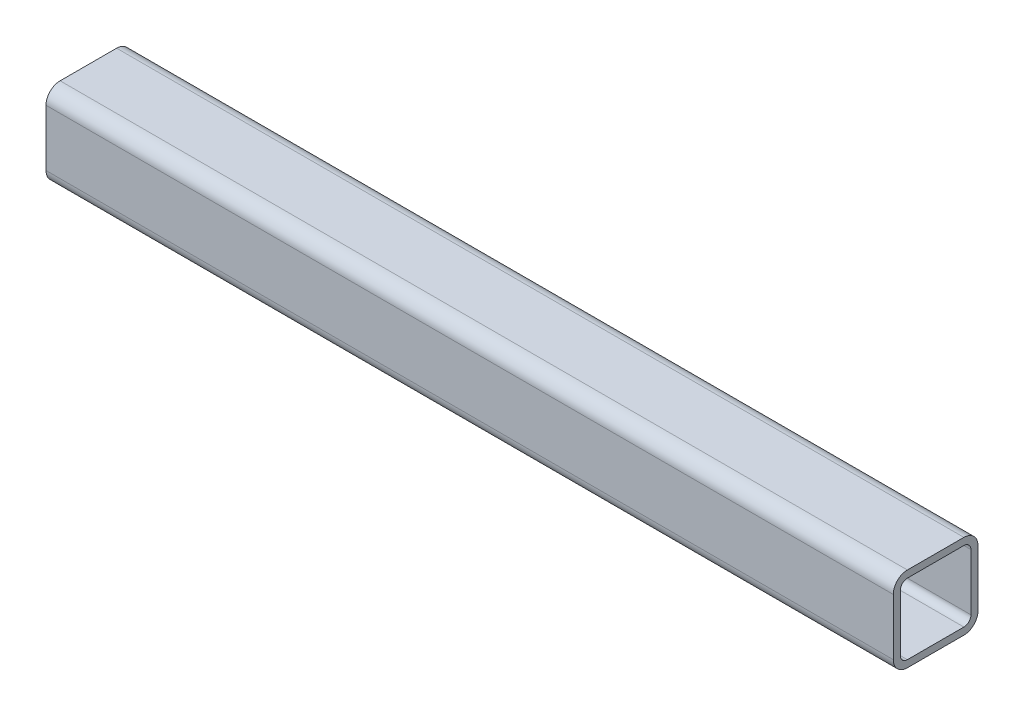
ISO-10303-21;
HEADER;
FILE_DESCRIPTION(('STEP AP214'),'2;1');
FILE_NAME('part.step','',(''),(''),'','','');
FILE_SCHEMA(('AUTOMOTIVE_DESIGN { 1 0 10303 214 1 1 1 1 }'));
ENDSEC;
DATA;
#1=APPLICATION_CONTEXT('core data for automotive mechanical design processes');
#2=APPLICATION_PROTOCOL_DEFINITION('international standard','automotive_design',2000,#1);
#3=PRODUCT_CONTEXT('',#1,'mechanical');
#4=PRODUCT('Part','Part','',(#3));
#5=PRODUCT_RELATED_PRODUCT_CATEGORY('part','',(#4));
#6=PRODUCT_DEFINITION_FORMATION('','',#4);
#7=PRODUCT_DEFINITION_CONTEXT('part definition',#1,'design');
#8=PRODUCT_DEFINITION('design','',#6,#7);
#9=PRODUCT_DEFINITION_SHAPE('','',#8);
#10=(LENGTH_UNIT() NAMED_UNIT(*) SI_UNIT(.MILLI.,.METRE.));
#11=(NAMED_UNIT(*) PLANE_ANGLE_UNIT() SI_UNIT($,.RADIAN.));
#12=(NAMED_UNIT(*) SI_UNIT($,.STERADIAN.) SOLID_ANGLE_UNIT());
#13=UNCERTAINTY_MEASURE_WITH_UNIT(LENGTH_MEASURE(1.E-05),#10,'distance_accuracy_value','');
#14=(GEOMETRIC_REPRESENTATION_CONTEXT(3) GLOBAL_UNCERTAINTY_ASSIGNED_CONTEXT((#13)) GLOBAL_UNIT_ASSIGNED_CONTEXT((#10,
#11,#12)) REPRESENTATION_CONTEXT('',''));
#15=CARTESIAN_POINT('',(0.,0.,0.));
#16=DIRECTION('',(0.,0.,1.));
#17=DIRECTION('',(1.,0.,0.));
#18=AXIS2_PLACEMENT_3D('',#15,#16,#17);
#19=CARTESIAN_POINT('',(-762.,25.4,25.4));
#20=DIRECTION('',(1.,0.,0.));
#21=DIRECTION('',(0.,0.,-1.));
#22=AXIS2_PLACEMENT_3D('',#19,#20,#21);
#23=CYLINDRICAL_SURFACE('',#22,12.7);
#24=CARTESIAN_POINT('',(0.,25.4,25.4));
#25=DIRECTION('',(-1.,0.,0.));
#26=DIRECTION('',(0.,0.,1.));
#27=AXIS2_PLACEMENT_3D('',#24,#25,#26);
#28=CIRCLE('',#27,12.7);
#29=CARTESIAN_POINT('',(0.,25.4,38.1));
#30=VERTEX_POINT('',#29);
#31=CARTESIAN_POINT('',(0.,38.1,25.4));
#32=VERTEX_POINT('',#31);
#33=EDGE_CURVE('E233',#30,#32,#28,.T.);
#34=ORIENTED_EDGE('',*,*,#33,.T.);
#35=DIRECTION('',(1.,0.,0.));
#36=VECTOR('',#35,1.);
#37=CARTESIAN_POINT('',(-762.,38.1,25.4));
#38=LINE('',#37,#36);
#39=CARTESIAN_POINT('',(-762.,38.1,25.4));
#40=VERTEX_POINT('',#39);
#41=EDGE_CURVE('E12',#40,#32,#38,.T.);
#42=ORIENTED_EDGE('',*,*,#41,.F.);
#43=CARTESIAN_POINT('',(-762.,25.4,25.4));
#44=DIRECTION('',(-1.,0.,0.));
#45=DIRECTION('',(0.,0.,1.));
#46=AXIS2_PLACEMENT_3D('',#43,#44,#45);
#47=CIRCLE('',#46,12.7);
#48=CARTESIAN_POINT('',(-762.,25.4,38.1));
#49=VERTEX_POINT('',#48);
#50=EDGE_CURVE('E311',#49,#40,#47,.T.);
#51=ORIENTED_EDGE('',*,*,#50,.F.);
#52=DIRECTION('',(1.,0.,0.));
#53=VECTOR('',#52,1.);
#54=CARTESIAN_POINT('',(-762.,25.4,38.1));
#55=LINE('',#54,#53);
#56=EDGE_CURVE('E248',#49,#30,#55,.T.);
#57=ORIENTED_EDGE('',*,*,#56,.T.);
#58=EDGE_LOOP('',(#34,#42,#51,#57));
#59=FACE_BOUND('',#58,.T.);
#60=ADVANCED_FACE('F61',(#59),#23,.T.);
#61=CARTESIAN_POINT('',(-762.,38.1,25.4));
#62=DIRECTION('',(0.,-1.,0.));
#63=DIRECTION('',(0.,0.,-1.));
#64=AXIS2_PLACEMENT_3D('',#61,#62,#63);
#65=PLANE('',#64);
#66=DIRECTION('',(0.,0.,-1.));
#67=VECTOR('',#66,1.);
#68=CARTESIAN_POINT('',(0.,38.1,25.4));
#69=LINE('',#68,#67);
#70=CARTESIAN_POINT('',(0.,38.1,-25.4));
#71=VERTEX_POINT('',#70);
#72=EDGE_CURVE('E236',#32,#71,#69,.T.);
#73=ORIENTED_EDGE('',*,*,#72,.T.);
#74=DIRECTION('',(1.,0.,0.));
#75=VECTOR('',#74,1.);
#76=CARTESIAN_POINT('',(-762.,38.1,-25.4));
#77=LINE('',#76,#75);
#78=CARTESIAN_POINT('',(-762.,38.1,-25.4));
#79=VERTEX_POINT('',#78);
#80=EDGE_CURVE('E71',#79,#71,#77,.T.);
#81=ORIENTED_EDGE('',*,*,#80,.F.);
#82=DIRECTION('',(0.,0.,-1.));
#83=VECTOR('',#82,1.);
#84=CARTESIAN_POINT('',(-762.,38.1,25.4));
#85=LINE('',#84,#83);
#86=EDGE_CURVE('E313',#40,#79,#85,.T.);
#87=ORIENTED_EDGE('',*,*,#86,.F.);
#88=ORIENTED_EDGE('',*,*,#41,.T.);
#89=EDGE_LOOP('',(#73,#81,#87,#88));
#90=FACE_BOUND('',#89,.T.);
#91=ADVANCED_FACE('F348',(#90),#65,.F.);
#92=CARTESIAN_POINT('',(-762.,25.4,-25.4));
#93=DIRECTION('',(1.,0.,0.));
#94=DIRECTION('',(0.,0.,-1.));
#95=AXIS2_PLACEMENT_3D('',#92,#93,#94);
#96=CYLINDRICAL_SURFACE('',#95,12.7);
#97=CARTESIAN_POINT('',(0.,25.4,-25.4));
#98=DIRECTION('',(-1.,0.,0.));
#99=DIRECTION('',(0.,0.,1.));
#100=AXIS2_PLACEMENT_3D('',#97,#98,#99);
#101=CIRCLE('',#100,12.7);
#102=CARTESIAN_POINT('',(0.,25.4,-38.1));
#103=VERTEX_POINT('',#102);
#104=EDGE_CURVE('E238',#71,#103,#101,.T.);
#105=ORIENTED_EDGE('',*,*,#104,.T.);
#106=DIRECTION('',(1.,0.,0.));
#107=VECTOR('',#106,1.);
#108=CARTESIAN_POINT('',(-762.,25.4,-38.1));
#109=LINE('',#108,#107);
#110=CARTESIAN_POINT('',(-762.,25.4,-38.1));
#111=VERTEX_POINT('',#110);
#112=EDGE_CURVE('E255',#111,#103,#109,.T.);
#113=ORIENTED_EDGE('',*,*,#112,.F.);
#114=CARTESIAN_POINT('',(-762.,25.4,-25.4));
#115=DIRECTION('',(-1.,0.,0.));
#116=DIRECTION('',(0.,0.,1.));
#117=AXIS2_PLACEMENT_3D('',#114,#115,#116);
#118=CIRCLE('',#117,12.7);
#119=EDGE_CURVE('E315',#79,#111,#118,.T.);
#120=ORIENTED_EDGE('',*,*,#119,.F.);
#121=ORIENTED_EDGE('',*,*,#80,.T.);
#122=EDGE_LOOP('',(#105,#113,#120,#121));
#123=FACE_BOUND('',#122,.T.);
#124=ADVANCED_FACE('F353',(#123),#96,.T.);
#125=CARTESIAN_POINT('',(-762.,-25.4,-38.1));
#126=DIRECTION('',(0.,0.,1.));
#127=DIRECTION('',(1.,0.,0.));
#128=AXIS2_PLACEMENT_3D('',#125,#126,#127);
#129=PLANE('',#128);
#130=DIRECTION('',(0.,-1.,0.));
#131=VECTOR('',#130,1.);
#132=CARTESIAN_POINT('',(0.,-25.4,-38.1));
#133=LINE('',#132,#131);
#134=CARTESIAN_POINT('',(0.,-25.4,-38.1));
#135=VERTEX_POINT('',#134);
#136=EDGE_CURVE('E240',#103,#135,#133,.T.);
#137=ORIENTED_EDGE('',*,*,#136,.T.);
#138=DIRECTION('',(1.,0.,0.));
#139=VECTOR('',#138,1.);
#140=CARTESIAN_POINT('',(-762.,-25.4,-38.1));
#141=LINE('',#140,#139);
#142=CARTESIAN_POINT('',(-762.,-25.4,-38.1));
#143=VERTEX_POINT('',#142);
#144=EDGE_CURVE('E252',#143,#135,#141,.T.);
#145=ORIENTED_EDGE('',*,*,#144,.F.);
#146=DIRECTION('',(0.,-1.,0.));
#147=VECTOR('',#146,1.);
#148=CARTESIAN_POINT('',(-762.,-25.4,-38.1));
#149=LINE('',#148,#147);
#150=EDGE_CURVE('E317',#111,#143,#149,.T.);
#151=ORIENTED_EDGE('',*,*,#150,.F.);
#152=ORIENTED_EDGE('',*,*,#112,.T.);
#153=EDGE_LOOP('',(#137,#145,#151,#152));
#154=FACE_BOUND('',#153,.T.);
#155=ADVANCED_FACE('F323',(#154),#129,.F.);
#156=CARTESIAN_POINT('',(-762.,-25.4,-25.4));
#157=DIRECTION('',(1.,0.,0.));
#158=DIRECTION('',(0.,0.,-1.));
#159=AXIS2_PLACEMENT_3D('',#156,#157,#158);
#160=CYLINDRICAL_SURFACE('',#159,12.7);
#161=CARTESIAN_POINT('',(0.,-25.4,-25.4));
#162=DIRECTION('',(-1.,0.,0.));
#163=DIRECTION('',(0.,0.,1.));
#164=AXIS2_PLACEMENT_3D('',#161,#162,#163);
#165=CIRCLE('',#164,12.7);
#166=CARTESIAN_POINT('',(0.,-38.1,-25.4));
#167=VERTEX_POINT('',#166);
#168=EDGE_CURVE('E242',#135,#167,#165,.T.);
#169=ORIENTED_EDGE('',*,*,#168,.T.);
#170=DIRECTION('',(1.,0.,0.));
#171=VECTOR('',#170,1.);
#172=CARTESIAN_POINT('',(-762.,-38.1,-25.4));
#173=LINE('',#172,#171);
#174=CARTESIAN_POINT('',(-762.,-38.1,-25.4));
#175=VERTEX_POINT('',#174);
#176=EDGE_CURVE('E200',#175,#167,#173,.T.);
#177=ORIENTED_EDGE('',*,*,#176,.F.);
#178=CARTESIAN_POINT('',(-762.,-25.4,-25.4));
#179=DIRECTION('',(-1.,0.,0.));
#180=DIRECTION('',(0.,0.,1.));
#181=AXIS2_PLACEMENT_3D('',#178,#179,#180);
#182=CIRCLE('',#181,12.7);
#183=EDGE_CURVE('E191',#143,#175,#182,.T.);
#184=ORIENTED_EDGE('',*,*,#183,.F.);
#185=ORIENTED_EDGE('',*,*,#144,.T.);
#186=EDGE_LOOP('',(#169,#177,#184,#185));
#187=FACE_BOUND('',#186,.T.);
#188=ADVANCED_FACE('F327',(#187),#160,.T.);
#189=CARTESIAN_POINT('',(-762.,-38.1,-25.4));
#190=DIRECTION('',(0.,1.,0.));
#191=DIRECTION('',(0.,0.,1.));
#192=AXIS2_PLACEMENT_3D('',#189,#190,#191);
#193=PLANE('',#192);
#194=DIRECTION('',(0.,0.,1.));
#195=VECTOR('',#194,1.);
#196=CARTESIAN_POINT('',(0.,-38.1,-25.4));
#197=LINE('',#196,#195);
#198=CARTESIAN_POINT('',(0.,-38.1,25.4));
#199=VERTEX_POINT('',#198);
#200=EDGE_CURVE('E199',#167,#199,#197,.T.);
#201=ORIENTED_EDGE('',*,*,#200,.T.);
#202=DIRECTION('',(1.,0.,0.));
#203=VECTOR('',#202,1.);
#204=CARTESIAN_POINT('',(-762.,-38.1,25.4));
#205=LINE('',#204,#203);
#206=CARTESIAN_POINT('',(-762.,-38.1,25.4));
#207=VERTEX_POINT('',#206);
#208=EDGE_CURVE('E196',#207,#199,#205,.T.);
#209=ORIENTED_EDGE('',*,*,#208,.F.);
#210=DIRECTION('',(0.,0.,1.));
#211=VECTOR('',#210,1.);
#212=CARTESIAN_POINT('',(-762.,-38.1,-25.4));
#213=LINE('',#212,#211);
#214=EDGE_CURVE('E185',#175,#207,#213,.T.);
#215=ORIENTED_EDGE('',*,*,#214,.F.);
#216=ORIENTED_EDGE('',*,*,#176,.T.);
#217=EDGE_LOOP('',(#201,#209,#215,#216));
#218=FACE_BOUND('',#217,.T.);
#219=ADVANCED_FACE('F197',(#218),#193,.F.);
#220=CARTESIAN_POINT('',(-762.,-25.4,25.4));
#221=DIRECTION('',(1.,0.,0.));
#222=DIRECTION('',(0.,0.,-1.));
#223=AXIS2_PLACEMENT_3D('',#220,#221,#222);
#224=CYLINDRICAL_SURFACE('',#223,12.7);
#225=CARTESIAN_POINT('',(0.,-25.4,25.4));
#226=DIRECTION('',(-1.,0.,0.));
#227=DIRECTION('',(0.,0.,1.));
#228=AXIS2_PLACEMENT_3D('',#225,#226,#227);
#229=CIRCLE('',#228,12.7);
#230=CARTESIAN_POINT('',(0.,-25.4,38.1));
#231=VERTEX_POINT('',#230);
#232=EDGE_CURVE('E133',#199,#231,#229,.T.);
#233=ORIENTED_EDGE('',*,*,#232,.T.);
#234=DIRECTION('',(1.,0.,0.));
#235=VECTOR('',#234,1.);
#236=CARTESIAN_POINT('',(-762.,-25.4,38.1));
#237=LINE('',#236,#235);
#238=CARTESIAN_POINT('',(-762.,-25.4,38.1));
#239=VERTEX_POINT('',#238);
#240=EDGE_CURVE('E201',#239,#231,#237,.T.);
#241=ORIENTED_EDGE('',*,*,#240,.F.);
#242=CARTESIAN_POINT('',(-762.,-25.4,25.4));
#243=DIRECTION('',(-1.,0.,0.));
#244=DIRECTION('',(0.,0.,1.));
#245=AXIS2_PLACEMENT_3D('',#242,#243,#244);
#246=CIRCLE('',#245,12.7);
#247=EDGE_CURVE('E189',#207,#239,#246,.T.);
#248=ORIENTED_EDGE('',*,*,#247,.F.);
#249=ORIENTED_EDGE('',*,*,#208,.T.);
#250=EDGE_LOOP('',(#233,#241,#248,#249));
#251=FACE_BOUND('',#250,.T.);
#252=ADVANCED_FACE('F203',(#251),#224,.T.);
#253=CARTESIAN_POINT('',(-762.,25.4,-25.4));
#254=DIRECTION('',(1.,0.,0.));
#255=DIRECTION('',(0.,0.,-1.));
#256=AXIS2_PLACEMENT_3D('',#253,#254,#255);
#257=CYLINDRICAL_SURFACE('',#256,6.34999999999999);
#258=CARTESIAN_POINT('',(0.,25.4,-25.4));
#259=DIRECTION('',(-1.,0.,0.));
#260=DIRECTION('',(0.,0.,1.));
#261=AXIS2_PLACEMENT_3D('',#258,#259,#260);
#262=CIRCLE('',#261,6.34999999999999);
#263=CARTESIAN_POINT('',(0.,31.75,-25.4));
#264=VERTEX_POINT('',#263);
#265=CARTESIAN_POINT('',(0.,25.4,-31.75));
#266=VERTEX_POINT('',#265);
#267=EDGE_CURVE('E209',#264,#266,#262,.T.);
#268=ORIENTED_EDGE('',*,*,#267,.F.);
#269=DIRECTION('',(1.,0.,0.));
#270=VECTOR('',#269,1.);
#271=CARTESIAN_POINT('',(-762.,31.75,-25.4));
#272=LINE('',#271,#270);
#273=CARTESIAN_POINT('',(-762.,31.75,-25.4));
#274=VERTEX_POINT('',#273);
#275=EDGE_CURVE('E65',#274,#264,#272,.T.);
#276=ORIENTED_EDGE('',*,*,#275,.F.);
#277=CARTESIAN_POINT('',(-762.,25.4,-25.4));
#278=DIRECTION('',(-1.,0.,0.));
#279=DIRECTION('',(0.,0.,1.));
#280=AXIS2_PLACEMENT_3D('',#277,#278,#279);
#281=CIRCLE('',#280,6.34999999999999);
#282=CARTESIAN_POINT('',(-762.,25.4,-31.75));
#283=VERTEX_POINT('',#282);
#284=EDGE_CURVE('E247',#274,#283,#281,.T.);
#285=ORIENTED_EDGE('',*,*,#284,.T.);
#286=DIRECTION('',(1.,0.,0.));
#287=VECTOR('',#286,1.);
#288=CARTESIAN_POINT('',(-762.,25.4,-31.75));
#289=LINE('',#288,#287);
#290=EDGE_CURVE('E205',#283,#266,#289,.T.);
#291=ORIENTED_EDGE('',*,*,#290,.T.);
#292=EDGE_LOOP('',(#268,#276,#285,#291));
#293=FACE_BOUND('',#292,.T.);
#294=ADVANCED_FACE('F63',(#293),#257,.F.);
#295=CARTESIAN_POINT('',(-762.,31.75,25.4));
#296=DIRECTION('',(0.,-1.,0.));
#297=DIRECTION('',(0.,0.,-1.));
#298=AXIS2_PLACEMENT_3D('',#295,#296,#297);
#299=PLANE('',#298);
#300=DIRECTION('',(0.,0.,-1.));
#301=VECTOR('',#300,1.);
#302=CARTESIAN_POINT('',(0.,31.75,25.4));
#303=LINE('',#302,#301);
#304=CARTESIAN_POINT('',(0.,31.75,25.4));
#305=VERTEX_POINT('',#304);
#306=EDGE_CURVE('E212',#305,#264,#303,.T.);
#307=ORIENTED_EDGE('',*,*,#306,.F.);
#308=DIRECTION('',(1.,0.,0.));
#309=VECTOR('',#308,1.);
#310=CARTESIAN_POINT('',(-762.,31.75,25.4));
#311=LINE('',#310,#309);
#312=CARTESIAN_POINT('',(-762.,31.75,25.4));
#313=VERTEX_POINT('',#312);
#314=EDGE_CURVE('E270',#313,#305,#311,.T.);
#315=ORIENTED_EDGE('',*,*,#314,.F.);
#316=DIRECTION('',(0.,0.,-1.));
#317=VECTOR('',#316,1.);
#318=CARTESIAN_POINT('',(-762.,31.75,25.4));
#319=LINE('',#318,#317);
#320=EDGE_CURVE('E279',#313,#274,#319,.T.);
#321=ORIENTED_EDGE('',*,*,#320,.T.);
#322=ORIENTED_EDGE('',*,*,#275,.T.);
#323=EDGE_LOOP('',(#307,#315,#321,#322));
#324=FACE_BOUND('',#323,.T.);
#325=ADVANCED_FACE('F277',(#324),#299,.T.);
#326=CARTESIAN_POINT('',(-762.,25.4,25.4));
#327=DIRECTION('',(1.,0.,0.));
#328=DIRECTION('',(0.,0.,-1.));
#329=AXIS2_PLACEMENT_3D('',#326,#327,#328);
#330=CYLINDRICAL_SURFACE('',#329,6.34999999999999);
#331=CARTESIAN_POINT('',(0.,25.4,25.4));
#332=DIRECTION('',(-1.,0.,0.));
#333=DIRECTION('',(0.,0.,1.));
#334=AXIS2_PLACEMENT_3D('',#331,#332,#333);
#335=CIRCLE('',#334,6.34999999999999);
#336=CARTESIAN_POINT('',(0.,25.4,31.75));
#337=VERTEX_POINT('',#336);
#338=EDGE_CURVE('E215',#337,#305,#335,.T.);
#339=ORIENTED_EDGE('',*,*,#338,.F.);
#340=DIRECTION('',(1.,0.,0.));
#341=VECTOR('',#340,1.);
#342=CARTESIAN_POINT('',(-762.,25.4,31.75));
#343=LINE('',#342,#341);
#344=CARTESIAN_POINT('',(-762.,25.4,31.75));
#345=VERTEX_POINT('',#344);
#346=EDGE_CURVE('E269',#345,#337,#343,.T.);
#347=ORIENTED_EDGE('',*,*,#346,.F.);
#348=CARTESIAN_POINT('',(-762.,25.4,25.4));
#349=DIRECTION('',(-1.,0.,0.));
#350=DIRECTION('',(0.,0.,1.));
#351=AXIS2_PLACEMENT_3D('',#348,#349,#350);
#352=CIRCLE('',#351,6.34999999999999);
#353=EDGE_CURVE('E287',#345,#313,#352,.T.);
#354=ORIENTED_EDGE('',*,*,#353,.T.);
#355=ORIENTED_EDGE('',*,*,#314,.T.);
#356=EDGE_LOOP('',(#339,#347,#354,#355));
#357=FACE_BOUND('',#356,.T.);
#358=ADVANCED_FACE('F285',(#357),#330,.F.);
#359=CARTESIAN_POINT('',(-762.,25.4,31.75));
#360=DIRECTION('',(0.,0.,-1.));
#361=DIRECTION('',(-1.,0.,0.));
#362=AXIS2_PLACEMENT_3D('',#359,#360,#361);
#363=PLANE('',#362);
#364=DIRECTION('',(0.,1.,0.));
#365=VECTOR('',#364,1.);
#366=CARTESIAN_POINT('',(0.,25.4,31.75));
#367=LINE('',#366,#365);
#368=CARTESIAN_POINT('',(0.,-25.4,31.75));
#369=VERTEX_POINT('',#368);
#370=EDGE_CURVE('E218',#369,#337,#367,.T.);
#371=ORIENTED_EDGE('',*,*,#370,.F.);
#372=DIRECTION('',(1.,0.,0.));
#373=VECTOR('',#372,1.);
#374=CARTESIAN_POINT('',(-762.,-25.4,31.75));
#375=LINE('',#374,#373);
#376=CARTESIAN_POINT('',(-762.,-25.4,31.75));
#377=VERTEX_POINT('',#376);
#378=EDGE_CURVE('E267',#377,#369,#375,.T.);
#379=ORIENTED_EDGE('',*,*,#378,.F.);
#380=DIRECTION('',(0.,1.,0.));
#381=VECTOR('',#380,1.);
#382=CARTESIAN_POINT('',(-762.,25.4,31.75));
#383=LINE('',#382,#381);
#384=EDGE_CURVE('E293',#377,#345,#383,.T.);
#385=ORIENTED_EDGE('',*,*,#384,.T.);
#386=ORIENTED_EDGE('',*,*,#346,.T.);
#387=EDGE_LOOP('',(#371,#379,#385,#386));
#388=FACE_BOUND('',#387,.T.);
#389=ADVANCED_FACE('F296',(#388),#363,.T.);
#390=CARTESIAN_POINT('',(-762.,-25.4,25.4));
#391=DIRECTION('',(1.,0.,0.));
#392=DIRECTION('',(0.,0.,-1.));
#393=AXIS2_PLACEMENT_3D('',#390,#391,#392);
#394=CYLINDRICAL_SURFACE('',#393,6.34999999999999);
#395=CARTESIAN_POINT('',(0.,-25.4,25.4));
#396=DIRECTION('',(-1.,0.,0.));
#397=DIRECTION('',(0.,0.,1.));
#398=AXIS2_PLACEMENT_3D('',#395,#396,#397);
#399=CIRCLE('',#398,6.34999999999999);
#400=CARTESIAN_POINT('',(0.,-31.75,25.4));
#401=VERTEX_POINT('',#400);
#402=EDGE_CURVE('E221',#401,#369,#399,.T.);
#403=ORIENTED_EDGE('',*,*,#402,.F.);
#404=DIRECTION('',(1.,0.,0.));
#405=VECTOR('',#404,1.);
#406=CARTESIAN_POINT('',(-762.,-31.75,25.4));
#407=LINE('',#406,#405);
#408=CARTESIAN_POINT('',(-762.,-31.75,25.4));
#409=VERTEX_POINT('',#408);
#410=EDGE_CURVE('E265',#409,#401,#407,.T.);
#411=ORIENTED_EDGE('',*,*,#410,.F.);
#412=CARTESIAN_POINT('',(-762.,-25.4,25.4));
#413=DIRECTION('',(-1.,0.,0.));
#414=DIRECTION('',(0.,0.,1.));
#415=AXIS2_PLACEMENT_3D('',#412,#413,#414);
#416=CIRCLE('',#415,6.34999999999999);
#417=EDGE_CURVE('E297',#409,#377,#416,.T.);
#418=ORIENTED_EDGE('',*,*,#417,.T.);
#419=ORIENTED_EDGE('',*,*,#378,.T.);
#420=EDGE_LOOP('',(#403,#411,#418,#419));
#421=FACE_BOUND('',#420,.T.);
#422=ADVANCED_FACE('F364',(#421),#394,.F.);
#423=CARTESIAN_POINT('',(-762.,-31.75,-25.4));
#424=DIRECTION('',(0.,1.,0.));
#425=DIRECTION('',(0.,0.,1.));
#426=AXIS2_PLACEMENT_3D('',#423,#424,#425);
#427=PLANE('',#426);
#428=DIRECTION('',(0.,0.,1.));
#429=VECTOR('',#428,1.);
#430=CARTESIAN_POINT('',(0.,-31.75,-25.4));
#431=LINE('',#430,#429);
#432=CARTESIAN_POINT('',(0.,-31.75,-25.4));
#433=VERTEX_POINT('',#432);
#434=EDGE_CURVE('E224',#433,#401,#431,.T.);
#435=ORIENTED_EDGE('',*,*,#434,.F.);
#436=DIRECTION('',(1.,0.,0.));
#437=VECTOR('',#436,1.);
#438=CARTESIAN_POINT('',(-762.,-31.75,-25.4));
#439=LINE('',#438,#437);
#440=CARTESIAN_POINT('',(-762.,-31.75,-25.4));
#441=VERTEX_POINT('',#440);
#442=EDGE_CURVE('E263',#441,#433,#439,.T.);
#443=ORIENTED_EDGE('',*,*,#442,.F.);
#444=DIRECTION('',(0.,0.,1.));
#445=VECTOR('',#444,1.);
#446=CARTESIAN_POINT('',(-762.,-31.75,-25.4));
#447=LINE('',#446,#445);
#448=EDGE_CURVE('E299',#441,#409,#447,.T.);
#449=ORIENTED_EDGE('',*,*,#448,.T.);
#450=ORIENTED_EDGE('',*,*,#410,.T.);
#451=EDGE_LOOP('',(#435,#443,#449,#450));
#452=FACE_BOUND('',#451,.T.);
#453=ADVANCED_FACE('F360',(#452),#427,.T.);
#454=CARTESIAN_POINT('',(-762.,-25.4,-25.4));
#455=DIRECTION('',(1.,0.,0.));
#456=DIRECTION('',(0.,0.,-1.));
#457=AXIS2_PLACEMENT_3D('',#454,#455,#456);
#458=CYLINDRICAL_SURFACE('',#457,6.34999999999999);
#459=CARTESIAN_POINT('',(0.,-25.4,-25.4));
#460=DIRECTION('',(-1.,0.,0.));
#461=DIRECTION('',(0.,0.,1.));
#462=AXIS2_PLACEMENT_3D('',#459,#460,#461);
#463=CIRCLE('',#462,6.34999999999999);
#464=CARTESIAN_POINT('',(0.,-25.4,-31.75));
#465=VERTEX_POINT('',#464);
#466=EDGE_CURVE('E227',#465,#433,#463,.T.);
#467=ORIENTED_EDGE('',*,*,#466,.F.);
#468=DIRECTION('',(1.,0.,0.));
#469=VECTOR('',#468,1.);
#470=CARTESIAN_POINT('',(-762.,-25.4,-31.75));
#471=LINE('',#470,#469);
#472=CARTESIAN_POINT('',(-762.,-25.4,-31.75));
#473=VERTEX_POINT('',#472);
#474=EDGE_CURVE('E261',#473,#465,#471,.T.);
#475=ORIENTED_EDGE('',*,*,#474,.F.);
#476=CARTESIAN_POINT('',(-762.,-25.4,-25.4));
#477=DIRECTION('',(-1.,0.,0.));
#478=DIRECTION('',(0.,0.,1.));
#479=AXIS2_PLACEMENT_3D('',#476,#477,#478);
#480=CIRCLE('',#479,6.34999999999999);
#481=EDGE_CURVE('E305',#473,#441,#480,.T.);
#482=ORIENTED_EDGE('',*,*,#481,.T.);
#483=ORIENTED_EDGE('',*,*,#442,.T.);
#484=EDGE_LOOP('',(#467,#475,#482,#483));
#485=FACE_BOUND('',#484,.T.);
#486=ADVANCED_FACE('F342',(#485),#458,.F.);
#487=CARTESIAN_POINT('',(-762.,-25.4,-31.75));
#488=DIRECTION('',(0.,0.,1.));
#489=DIRECTION('',(1.,0.,0.));
#490=AXIS2_PLACEMENT_3D('',#487,#488,#489);
#491=PLANE('',#490);
#492=DIRECTION('',(0.,-1.,0.));
#493=VECTOR('',#492,1.);
#494=CARTESIAN_POINT('',(0.,-25.4,-31.75));
#495=LINE('',#494,#493);
#496=EDGE_CURVE('E230',#266,#465,#495,.T.);
#497=ORIENTED_EDGE('',*,*,#496,.F.);
#498=ORIENTED_EDGE('',*,*,#290,.F.);
#499=DIRECTION('',(0.,-1.,0.));
#500=VECTOR('',#499,1.);
#501=CARTESIAN_POINT('',(-762.,-25.4,-31.75));
#502=LINE('',#501,#500);
#503=EDGE_CURVE('E308',#283,#473,#502,.T.);
#504=ORIENTED_EDGE('',*,*,#503,.T.);
#505=ORIENTED_EDGE('',*,*,#474,.T.);
#506=EDGE_LOOP('',(#497,#498,#504,#505));
#507=FACE_BOUND('',#506,.T.);
#508=ADVANCED_FACE('F335',(#507),#491,.T.);
#509=CARTESIAN_POINT('',(-762.,25.4,38.1));
#510=DIRECTION('',(0.,0.,-1.));
#511=DIRECTION('',(-1.,0.,0.));
#512=AXIS2_PLACEMENT_3D('',#509,#510,#511);
#513=PLANE('',#512);
#514=DIRECTION('',(0.,1.,0.));
#515=VECTOR('',#514,1.);
#516=CARTESIAN_POINT('',(0.,25.4,38.1));
#517=LINE('',#516,#515);
#518=EDGE_CURVE('E139',#231,#30,#517,.T.);
#519=ORIENTED_EDGE('',*,*,#518,.T.);
#520=ORIENTED_EDGE('',*,*,#56,.F.);
#521=DIRECTION('',(0.,1.,0.));
#522=VECTOR('',#521,1.);
#523=CARTESIAN_POINT('',(-762.,25.4,38.1));
#524=LINE('',#523,#522);
#525=EDGE_CURVE('E80',#239,#49,#524,.T.);
#526=ORIENTED_EDGE('',*,*,#525,.F.);
#527=ORIENTED_EDGE('',*,*,#240,.T.);
#528=EDGE_LOOP('',(#519,#520,#526,#527));
#529=FACE_BOUND('',#528,.T.);
#530=ADVANCED_FACE('F333',(#529),#513,.F.);
#531=CARTESIAN_POINT('',(-762.,25.4,25.4));
#532=DIRECTION('',(-1.,0.,0.));
#533=DIRECTION('',(0.,0.,1.));
#534=AXIS2_PLACEMENT_3D('',#531,#532,#533);
#535=PLANE('',#534);
#536=ORIENTED_EDGE('',*,*,#284,.F.);
#537=ORIENTED_EDGE('',*,*,#320,.F.);
#538=ORIENTED_EDGE('',*,*,#353,.F.);
#539=ORIENTED_EDGE('',*,*,#384,.F.);
#540=ORIENTED_EDGE('',*,*,#417,.F.);
#541=ORIENTED_EDGE('',*,*,#448,.F.);
#542=ORIENTED_EDGE('',*,*,#481,.F.);
#543=ORIENTED_EDGE('',*,*,#503,.F.);
#544=EDGE_LOOP('',(#536,#537,#538,#539,#540,#541,#542,#543));
#545=FACE_BOUND('',#544,.T.);
#546=ORIENTED_EDGE('',*,*,#50,.T.);
#547=ORIENTED_EDGE('',*,*,#86,.T.);
#548=ORIENTED_EDGE('',*,*,#119,.T.);
#549=ORIENTED_EDGE('',*,*,#150,.T.);
#550=ORIENTED_EDGE('',*,*,#183,.T.);
#551=ORIENTED_EDGE('',*,*,#214,.T.);
#552=ORIENTED_EDGE('',*,*,#247,.T.);
#553=ORIENTED_EDGE('',*,*,#525,.T.);
#554=EDGE_LOOP('',(#546,#547,#548,#549,#550,#551,#552,#553));
#555=FACE_BOUND('',#554,.T.);
#556=ADVANCED_FACE('F187',(#545,#555),#535,.T.);
#557=CARTESIAN_POINT('',(0.,25.4,25.4));
#558=DIRECTION('',(-1.,0.,0.));
#559=DIRECTION('',(0.,0.,1.));
#560=AXIS2_PLACEMENT_3D('',#557,#558,#559);
#561=PLANE('',#560);
#562=ORIENTED_EDGE('',*,*,#267,.T.);
#563=ORIENTED_EDGE('',*,*,#496,.T.);
#564=ORIENTED_EDGE('',*,*,#466,.T.);
#565=ORIENTED_EDGE('',*,*,#434,.T.);
#566=ORIENTED_EDGE('',*,*,#402,.T.);
#567=ORIENTED_EDGE('',*,*,#370,.T.);
#568=ORIENTED_EDGE('',*,*,#338,.T.);
#569=ORIENTED_EDGE('',*,*,#306,.T.);
#570=EDGE_LOOP('',(#562,#563,#564,#565,#566,#567,#568,#569));
#571=FACE_BOUND('',#570,.T.);
#572=ORIENTED_EDGE('',*,*,#33,.F.);
#573=ORIENTED_EDGE('',*,*,#518,.F.);
#574=ORIENTED_EDGE('',*,*,#232,.F.);
#575=ORIENTED_EDGE('',*,*,#200,.F.);
#576=ORIENTED_EDGE('',*,*,#168,.F.);
#577=ORIENTED_EDGE('',*,*,#136,.F.);
#578=ORIENTED_EDGE('',*,*,#104,.F.);
#579=ORIENTED_EDGE('',*,*,#72,.F.);
#580=EDGE_LOOP('',(#572,#573,#574,#575,#576,#577,#578,#579));
#581=FACE_BOUND('',#580,.T.);
#582=ADVANCED_FACE('F282',(#571,#581),#561,.F.);
#583=CLOSED_SHELL('',(#60,#91,#124,#155,#188,#219,#252,#294,#325,#358,#389,#422,#453,#486,#508,
#530,#556,#582));
#584=MANIFOLD_SOLID_BREP('B2',#583);
#585=ADVANCED_BREP_SHAPE_REPRESENTATION('',(#18,#584),#14);
#586=SHAPE_DEFINITION_REPRESENTATION(#9,#585);
ENDSEC;
END-ISO-10303-21;
